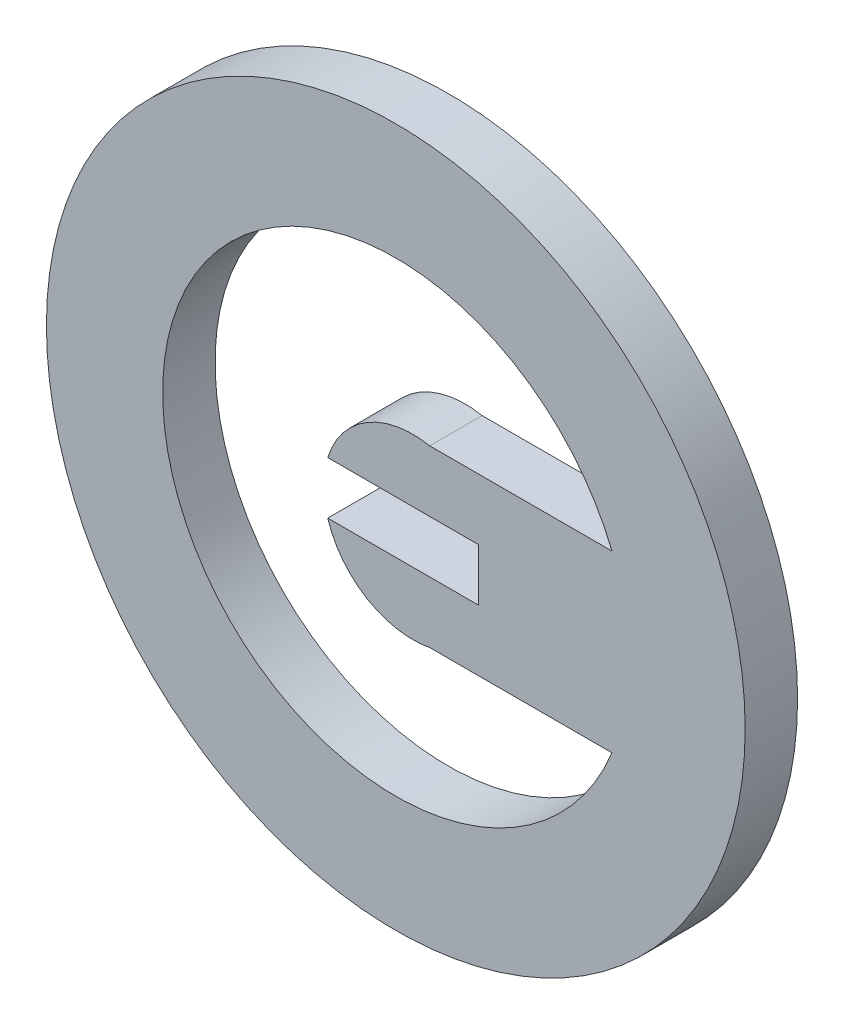
ISO-10303-21;
HEADER;
FILE_DESCRIPTION(('STEP AP214'),'2;1');
FILE_NAME('part.step','',(''),(''),'','','');
FILE_SCHEMA(('AUTOMOTIVE_DESIGN { 1 0 10303 214 1 1 1 1 }'));
ENDSEC;
DATA;
#1=APPLICATION_CONTEXT('core data for automotive mechanical design processes');
#2=APPLICATION_PROTOCOL_DEFINITION('international standard','automotive_design',2000,#1);
#3=PRODUCT_CONTEXT('',#1,'mechanical');
#4=PRODUCT('Part','Part','',(#3));
#5=PRODUCT_RELATED_PRODUCT_CATEGORY('part','',(#4));
#6=PRODUCT_DEFINITION_FORMATION('','',#4);
#7=PRODUCT_DEFINITION_CONTEXT('part definition',#1,'design');
#8=PRODUCT_DEFINITION('design','',#6,#7);
#9=PRODUCT_DEFINITION_SHAPE('','',#8);
#10=(LENGTH_UNIT() NAMED_UNIT(*) SI_UNIT(.MILLI.,.METRE.));
#11=(NAMED_UNIT(*) PLANE_ANGLE_UNIT() SI_UNIT($,.RADIAN.));
#12=(NAMED_UNIT(*) SI_UNIT($,.STERADIAN.) SOLID_ANGLE_UNIT());
#13=UNCERTAINTY_MEASURE_WITH_UNIT(LENGTH_MEASURE(1.E-05),#10,'distance_accuracy_value','');
#14=(GEOMETRIC_REPRESENTATION_CONTEXT(3) GLOBAL_UNCERTAINTY_ASSIGNED_CONTEXT((#13)) GLOBAL_UNIT_ASSIGNED_CONTEXT((#10,
#11,#12)) REPRESENTATION_CONTEXT('',''));
#15=CARTESIAN_POINT('',(0.,0.,0.));
#16=DIRECTION('',(0.,0.,1.));
#17=DIRECTION('',(1.,0.,0.));
#18=AXIS2_PLACEMENT_3D('',#15,#16,#17);
#19=CARTESIAN_POINT('',(0.,0.,2.99999999999998));
#20=DIRECTION('',(0.,0.,1.));
#21=DIRECTION('',(1.,0.,0.));
#22=AXIS2_PLACEMENT_3D('',#19,#20,#21);
#23=PLANE('',#22);
#24=CARTESIAN_POINT('',(0.,0.,2.99999999999998));
#25=DIRECTION('',(0.,0.,1.));
#26=DIRECTION('',(1.,0.,0.));
#27=AXIS2_PLACEMENT_3D('',#24,#25,#26);
#28=CIRCLE('',#27,20.);
#29=CARTESIAN_POINT('',(-19.9999999999999,0.,2.99999999999997));
#30=VERTEX_POINT('',#29);
#31=EDGE_CURVE('E11',#30,#30,#28,.T.);
#32=ORIENTED_EDGE('',*,*,#31,.T.);
#33=EDGE_LOOP('',(#32));
#34=FACE_BOUND('',#33,.T.);
#35=DIRECTION('',(1.,0.,0.));
#36=VECTOR('',#35,1.);
#37=CARTESIAN_POINT('',(-3.89564307879012,-1.5,2.99999999999998));
#38=LINE('',#37,#36);
#39=CARTESIAN_POINT('',(-3.89564307879012,-1.5,2.99999999999998));
#40=VERTEX_POINT('',#39);
#41=CARTESIAN_POINT('',(4.73620170339689,-1.50000000000001,2.99999999999996));
#42=VERTEX_POINT('',#41);
#43=EDGE_CURVE('E134',#40,#42,#38,.T.);
#44=ORIENTED_EDGE('',*,*,#43,.F.);
#45=CARTESIAN_POINT('',(0.972107152720308,0.,2.99999999999998));
#46=DIRECTION('',(0.,0.,-1.));
#47=DIRECTION('',(1.,0.,0.));
#48=AXIS2_PLACEMENT_3D('',#45,#46,#47);
#49=CIRCLE('',#48,5.09362271044586);
#50=CARTESIAN_POINT('',(1.94421430544053,-5.00000000000002,2.99999999999999));
#51=VERTEX_POINT('',#50);
#52=EDGE_CURVE('E112',#51,#40,#49,.T.);
#53=ORIENTED_EDGE('',*,*,#52,.F.);
#54=DIRECTION('',(-1.,0.,0.));
#55=VECTOR('',#54,1.);
#56=CARTESIAN_POINT('',(1.94421430544053,-5.00000000000002,2.99999999999999));
#57=LINE('',#56,#55);
#58=CARTESIAN_POINT('',(12.3734497336033,-5.,2.99999999999998));
#59=VERTEX_POINT('',#58);
#60=EDGE_CURVE('E146',#59,#51,#57,.T.);
#61=ORIENTED_EDGE('',*,*,#60,.F.);
#62=CARTESIAN_POINT('',(0.,0.,2.99999999999998));
#63=DIRECTION('',(0.,0.,1.));
#64=DIRECTION('',(1.,0.,0.));
#65=AXIS2_PLACEMENT_3D('',#62,#63,#64);
#66=CIRCLE('',#65,13.3454958060766);
#67=CARTESIAN_POINT('',(12.3734497336033,4.99999999999999,3.));
#68=VERTEX_POINT('',#67);
#69=EDGE_CURVE('E144',#68,#59,#66,.T.);
#70=ORIENTED_EDGE('',*,*,#69,.F.);
#71=DIRECTION('',(1.,0.,0.));
#72=VECTOR('',#71,1.);
#73=CARTESIAN_POINT('',(1.94421430544053,4.99999999999999,2.99999999999996));
#74=LINE('',#73,#72);
#75=CARTESIAN_POINT('',(1.94421430544053,4.99999999999999,2.99999999999996));
#76=VERTEX_POINT('',#75);
#77=EDGE_CURVE('E142',#76,#68,#74,.T.);
#78=ORIENTED_EDGE('',*,*,#77,.F.);
#79=CARTESIAN_POINT('',(0.972107152720308,0.,2.99999999999998));
#80=DIRECTION('',(0.,0.,-1.));
#81=DIRECTION('',(1.,0.,0.));
#82=AXIS2_PLACEMENT_3D('',#79,#80,#81);
#83=CIRCLE('',#82,5.09362271044586);
#84=CARTESIAN_POINT('',(-3.89564307879021,1.49999999999999,2.99999999999998));
#85=VERTEX_POINT('',#84);
#86=EDGE_CURVE('E140',#85,#76,#83,.T.);
#87=ORIENTED_EDGE('',*,*,#86,.F.);
#88=DIRECTION('',(-1.,0.,0.));
#89=VECTOR('',#88,1.);
#90=CARTESIAN_POINT('',(-3.89564307879021,1.49999999999999,2.99999999999998));
#91=LINE('',#90,#89);
#92=CARTESIAN_POINT('',(4.7362017033968,1.49999999999999,2.99999999999996));
#93=VERTEX_POINT('',#92);
#94=EDGE_CURVE('E138',#93,#85,#91,.T.);
#95=ORIENTED_EDGE('',*,*,#94,.F.);
#96=DIRECTION('',(0.,1.,0.));
#97=VECTOR('',#96,1.);
#98=CARTESIAN_POINT('',(4.7362017033968,1.49999999999999,2.99999999999996));
#99=LINE('',#98,#97);
#100=EDGE_CURVE('E136',#42,#93,#99,.T.);
#101=ORIENTED_EDGE('',*,*,#100,.F.);
#102=EDGE_LOOP('',(#44,#53,#61,#70,#78,#87,#95,#101));
#103=FACE_BOUND('',#102,.T.);
#104=ADVANCED_FACE('F32',(#34,#103),#23,.T.);
#105=CARTESIAN_POINT('',(0.,0.,0.));
#106=DIRECTION('',(0.,0.,1.));
#107=DIRECTION('',(1.,0.,0.));
#108=AXIS2_PLACEMENT_3D('',#105,#106,#107);
#109=PLANE('',#108);
#110=CARTESIAN_POINT('',(0.,0.,0.));
#111=DIRECTION('',(0.,0.,1.));
#112=DIRECTION('',(1.,0.,0.));
#113=AXIS2_PLACEMENT_3D('',#110,#111,#112);
#114=CIRCLE('',#113,20.);
#115=CARTESIAN_POINT('',(-19.9999999999999,0.,0.));
#116=VERTEX_POINT('',#115);
#117=EDGE_CURVE('E40',#116,#116,#114,.T.);
#118=ORIENTED_EDGE('',*,*,#117,.F.);
#119=EDGE_LOOP('',(#118));
#120=FACE_BOUND('',#119,.T.);
#121=CARTESIAN_POINT('',(0.972107152720246,0.,0.));
#122=DIRECTION('',(0.,0.,-1.));
#123=DIRECTION('',(1.,0.,0.));
#124=AXIS2_PLACEMENT_3D('',#121,#122,#123);
#125=CIRCLE('',#124,5.09362271044586);
#126=CARTESIAN_POINT('',(1.9442143054405,-5.,0.));
#127=VERTEX_POINT('',#126);
#128=CARTESIAN_POINT('',(-3.89564307879017,-1.5,0.));
#129=VERTEX_POINT('',#128);
#130=EDGE_CURVE('E55',#127,#129,#125,.T.);
#131=ORIENTED_EDGE('',*,*,#130,.T.);
#132=DIRECTION('',(1.,0.,0.));
#133=VECTOR('',#132,1.);
#134=CARTESIAN_POINT('',(-3.89564307879017,-1.5,0.));
#135=LINE('',#134,#133);
#136=CARTESIAN_POINT('',(4.73620170339689,-1.5,0.));
#137=VERTEX_POINT('',#136);
#138=EDGE_CURVE('E99',#129,#137,#135,.T.);
#139=ORIENTED_EDGE('',*,*,#138,.T.);
#140=DIRECTION('',(0.,1.,0.));
#141=VECTOR('',#140,1.);
#142=CARTESIAN_POINT('',(4.73620170339686,1.5,0.));
#143=LINE('',#142,#141);
#144=CARTESIAN_POINT('',(4.73620170339686,1.5,0.));
#145=VERTEX_POINT('',#144);
#146=EDGE_CURVE('E108',#137,#145,#143,.T.);
#147=ORIENTED_EDGE('',*,*,#146,.T.);
#148=DIRECTION('',(-1.,0.,0.));
#149=VECTOR('',#148,1.);
#150=CARTESIAN_POINT('',(-3.89564307879017,1.49999999999999,0.));
#151=LINE('',#150,#149);
#152=CARTESIAN_POINT('',(-3.89564307879017,1.49999999999999,0.));
#153=VERTEX_POINT('',#152);
#154=EDGE_CURVE('E121',#145,#153,#151,.T.);
#155=ORIENTED_EDGE('',*,*,#154,.T.);
#156=CARTESIAN_POINT('',(0.972107152720246,0.,0.));
#157=DIRECTION('',(0.,0.,-1.));
#158=DIRECTION('',(1.,0.,0.));
#159=AXIS2_PLACEMENT_3D('',#156,#157,#158);
#160=CIRCLE('',#159,5.09362271044586);
#161=CARTESIAN_POINT('',(1.94421430544053,4.99999999999999,0.));
#162=VERTEX_POINT('',#161);
#163=EDGE_CURVE('E124',#153,#162,#160,.T.);
#164=ORIENTED_EDGE('',*,*,#163,.T.);
#165=DIRECTION('',(1.,0.,0.));
#166=VECTOR('',#165,1.);
#167=CARTESIAN_POINT('',(1.94421430544053,4.99999999999999,0.));
#168=LINE('',#167,#166);
#169=CARTESIAN_POINT('',(12.3734497336033,4.99999999999999,0.));
#170=VERTEX_POINT('',#169);
#171=EDGE_CURVE('E127',#162,#170,#168,.T.);
#172=ORIENTED_EDGE('',*,*,#171,.T.);
#173=CARTESIAN_POINT('',(0.,0.,0.));
#174=DIRECTION('',(0.,0.,1.));
#175=DIRECTION('',(1.,0.,0.));
#176=AXIS2_PLACEMENT_3D('',#173,#174,#175);
#177=CIRCLE('',#176,13.3454958060766);
#178=CARTESIAN_POINT('',(12.3734497336033,-5.,0.));
#179=VERTEX_POINT('',#178);
#180=EDGE_CURVE('E130',#170,#179,#177,.T.);
#181=ORIENTED_EDGE('',*,*,#180,.T.);
#182=DIRECTION('',(-1.,0.,0.));
#183=VECTOR('',#182,1.);
#184=CARTESIAN_POINT('',(1.9442143054405,-5.,0.));
#185=LINE('',#184,#183);
#186=EDGE_CURVE('E117',#179,#127,#185,.T.);
#187=ORIENTED_EDGE('',*,*,#186,.T.);
#188=EDGE_LOOP('',(#131,#139,#147,#155,#164,#172,#181,#187));
#189=FACE_BOUND('',#188,.T.);
#190=ADVANCED_FACE('F115',(#120,#189),#109,.F.);
#191=CARTESIAN_POINT('',(0.,0.,2.99999999999998));
#192=DIRECTION('',(0.,0.,-1.));
#193=DIRECTION('',(-1.,0.,0.));
#194=AXIS2_PLACEMENT_3D('',#191,#192,#193);
#195=CYLINDRICAL_SURFACE('',#194,20.);
#196=CARTESIAN_POINT('',(-19.9999999999999,0.,2.99999999999997));
#197=CARTESIAN_POINT('',(-19.9999999999999,0.,2.96874999999997));
#198=CARTESIAN_POINT('',(-19.9999999999999,0.,2.93749999999997));
#199=CARTESIAN_POINT('',(-19.9999999999999,0.,2.87499999999997));
#200=CARTESIAN_POINT('',(-19.9999999999999,0.,2.84374999999997));
#201=CARTESIAN_POINT('',(-19.9999999999999,0.,2.78124999999997));
#202=CARTESIAN_POINT('',(-19.9999999999999,0.,2.74999999999997));
#203=CARTESIAN_POINT('',(-19.9999999999999,0.,2.68749999999997));
#204=CARTESIAN_POINT('',(-19.9999999999999,0.,2.65624999999997));
#205=CARTESIAN_POINT('',(-19.9999999999999,0.,2.59374999999997));
#206=CARTESIAN_POINT('',(-19.9999999999999,0.,2.56249999999997));
#207=CARTESIAN_POINT('',(-19.9999999999999,0.,2.49999999999997));
#208=CARTESIAN_POINT('',(-19.9999999999999,0.,2.46874999999997));
#209=CARTESIAN_POINT('',(-19.9999999999999,0.,2.40624999999997));
#210=CARTESIAN_POINT('',(-19.9999999999999,0.,2.37499999999997));
#211=CARTESIAN_POINT('',(-19.9999999999999,0.,2.31249999999997));
#212=CARTESIAN_POINT('',(-19.9999999999999,0.,2.28124999999997));
#213=CARTESIAN_POINT('',(-19.9999999999999,0.,2.21874999999997));
#214=CARTESIAN_POINT('',(-19.9999999999999,0.,2.18749999999997));
#215=CARTESIAN_POINT('',(-19.9999999999999,0.,2.12499999999997));
#216=CARTESIAN_POINT('',(-19.9999999999999,0.,2.09374999999997));
#217=CARTESIAN_POINT('',(-19.9999999999999,0.,2.03124999999997));
#218=CARTESIAN_POINT('',(-19.9999999999999,0.,1.99999999999997));
#219=CARTESIAN_POINT('',(-19.9999999999999,0.,1.93749999999997));
#220=CARTESIAN_POINT('',(-19.9999999999999,0.,1.90624999999997));
#221=CARTESIAN_POINT('',(-19.9999999999999,0.,1.84374999999997));
#222=CARTESIAN_POINT('',(-19.9999999999999,0.,1.81249999999997));
#223=CARTESIAN_POINT('',(-19.9999999999999,0.,1.74999999999997));
#224=CARTESIAN_POINT('',(-19.9999999999999,0.,1.71874999999997));
#225=CARTESIAN_POINT('',(-19.9999999999999,0.,1.65624999999997));
#226=CARTESIAN_POINT('',(-19.9999999999999,0.,1.62499999999997));
#227=CARTESIAN_POINT('',(-19.9999999999999,0.,1.56249999999997));
#228=CARTESIAN_POINT('',(-19.9999999999999,0.,1.53124999999997));
#229=CARTESIAN_POINT('',(-19.9999999999999,0.,1.46874999999997));
#230=CARTESIAN_POINT('',(-19.9999999999999,0.,1.43749999999997));
#231=CARTESIAN_POINT('',(-19.9999999999999,0.,1.37499999999997));
#232=CARTESIAN_POINT('',(-19.9999999999999,0.,1.34374999999997));
#233=CARTESIAN_POINT('',(-19.9999999999999,0.,1.28124999999997));
#234=CARTESIAN_POINT('',(-19.9999999999999,0.,1.24999999999997));
#235=CARTESIAN_POINT('',(-19.9999999999999,0.,1.18749999999997));
#236=CARTESIAN_POINT('',(-19.9999999999999,0.,1.15624999999997));
#237=CARTESIAN_POINT('',(-19.9999999999999,0.,1.09374999999997));
#238=CARTESIAN_POINT('',(-19.9999999999999,0.,1.06249999999997));
#239=CARTESIAN_POINT('',(-19.9999999999999,0.,0.999999999999975));
#240=CARTESIAN_POINT('',(-19.9999999999999,0.,0.968749999999975));
#241=CARTESIAN_POINT('',(-19.9999999999999,0.,0.906249999999975));
#242=CARTESIAN_POINT('',(-19.9999999999999,0.,0.874999999999975));
#243=CARTESIAN_POINT('',(-19.9999999999999,0.,0.812499999999975));
#244=CARTESIAN_POINT('',(-19.9999999999999,0.,0.781249999999975));
#245=CARTESIAN_POINT('',(-19.9999999999999,0.,0.718749999999975));
#246=CARTESIAN_POINT('',(-19.9999999999999,0.,0.687499999999975));
#247=CARTESIAN_POINT('',(-19.9999999999999,0.,0.624999999999975));
#248=CARTESIAN_POINT('',(-19.9999999999999,0.,0.593749999999975));
#249=CARTESIAN_POINT('',(-19.9999999999999,0.,0.531249999999975));
#250=CARTESIAN_POINT('',(-19.9999999999999,0.,0.499999999999976));
#251=CARTESIAN_POINT('',(-19.9999999999999,0.,0.437499999999976));
#252=CARTESIAN_POINT('',(-19.9999999999999,0.,0.406249999999976));
#253=CARTESIAN_POINT('',(-19.9999999999999,0.,0.343749999999976));
#254=CARTESIAN_POINT('',(-19.9999999999999,0.,0.312499999999976));
#255=CARTESIAN_POINT('',(-19.9999999999999,0.,0.249999999999976));
#256=CARTESIAN_POINT('',(-19.9999999999999,0.,0.218749999999976));
#257=CARTESIAN_POINT('',(-19.9999999999999,0.,0.156249999999976));
#258=CARTESIAN_POINT('',(-19.9999999999999,0.,0.124999999999976));
#259=CARTESIAN_POINT('',(-19.9999999999999,0.,0.0624999999999762));
#260=CARTESIAN_POINT('',(-19.9999999999999,0.,0.0312499999999762));
#261=CARTESIAN_POINT('',(-19.9999999999999,0.,0.));
#262=B_SPLINE_CURVE_WITH_KNOTS('',3,(#196,#197,#198,#199,#200,#201,#202,#203,#204,#205,#206,
#207,#208,#209,#210,#211,#212,#213,#214,#215,#216,#217,#218,#219,#220,#221,#222,#223,#224,#225,
#226,#227,#228,#229,#230,#231,#232,#233,#234,#235,#236,#237,#238,#239,#240,#241,#242,#243,#244,
#245,#246,#247,#248,#249,#250,#251,#252,#253,#254,#255,#256,#257,#258,#259,#260,#261),
.UNSPECIFIED.,.F.,.F.,(4,2,2,2,2,2,2,2,2,2,2,2,2,2,2,2,2,2,2,2,2,2,2,2,2,2,2,2,2,2,2,2,4),(0.,
0.0937500000000001,0.1875,0.28125,0.375,0.46875,0.562499999999999,0.656249999999999,
0.749999999999999,0.843749999999999,0.937499999999999,1.03125,1.125,1.21875,1.3125,1.40625,1.5,
1.59375,1.6875,1.78125,1.875,1.96875,2.0625,2.15625,2.25,2.34375,2.4375,2.53125,2.625,2.71875,
2.8125,2.90625,3.),.UNSPECIFIED.);
#263=EDGE_CURVE('BSEAM34',#30,#116,#262,.T.);
#264=ORIENTED_EDGE('',*,*,#31,.F.);
#265=ORIENTED_EDGE('',*,*,#117,.T.);
#266=ORIENTED_EDGE('',*,*,#263,.T.);
#267=ORIENTED_EDGE('',*,*,#263,.F.);
#268=EDGE_LOOP('',(#264,#266,#265,#267));
#269=FACE_BOUND('',#268,.T.);
#270=ADVANCED_FACE('F34',(#269),#195,.T.);
#271=CARTESIAN_POINT('',(0.972107152720308,0.,2.99999999999998));
#272=DIRECTION('',(0.,0.,-1.));
#273=DIRECTION('',(-1.,0.,0.));
#274=AXIS2_PLACEMENT_3D('',#271,#272,#273);
#275=CYLINDRICAL_SURFACE('',#274,5.09362271044586);
#276=ORIENTED_EDGE('',*,*,#130,.F.);
#277=DIRECTION('',(0.,0.,-1.));
#278=VECTOR('',#277,1.);
#279=CARTESIAN_POINT('',(1.94421430544053,-5.00000000000002,2.99999999999999));
#280=LINE('',#279,#278);
#281=EDGE_CURVE('E148',#51,#127,#280,.T.);
#282=ORIENTED_EDGE('',*,*,#281,.F.);
#283=ORIENTED_EDGE('',*,*,#52,.T.);
#284=DIRECTION('',(0.,0.,-1.));
#285=VECTOR('',#284,1.);
#286=CARTESIAN_POINT('',(-3.89564307879012,-1.5,2.99999999999998));
#287=LINE('',#286,#285);
#288=EDGE_CURVE('E101',#40,#129,#287,.T.);
#289=ORIENTED_EDGE('',*,*,#288,.T.);
#290=EDGE_LOOP('',(#276,#282,#283,#289));
#291=FACE_BOUND('',#290,.T.);
#292=ADVANCED_FACE('F110',(#291),#275,.T.);
#293=CARTESIAN_POINT('',(-3.89564307879012,-1.5,2.99999999999998));
#294=DIRECTION('',(0.,1.,0.));
#295=DIRECTION('',(0.,0.,1.));
#296=AXIS2_PLACEMENT_3D('',#293,#294,#295);
#297=PLANE('',#296);
#298=ORIENTED_EDGE('',*,*,#138,.F.);
#299=ORIENTED_EDGE('',*,*,#288,.F.);
#300=ORIENTED_EDGE('',*,*,#43,.T.);
#301=DIRECTION('',(0.,0.,-1.));
#302=VECTOR('',#301,1.);
#303=CARTESIAN_POINT('',(4.73620170339689,-1.50000000000001,2.99999999999996));
#304=LINE('',#303,#302);
#305=EDGE_CURVE('E104',#42,#137,#304,.T.);
#306=ORIENTED_EDGE('',*,*,#305,.T.);
#307=EDGE_LOOP('',(#298,#299,#300,#306));
#308=FACE_BOUND('',#307,.T.);
#309=ADVANCED_FACE('F100',(#308),#297,.T.);
#310=CARTESIAN_POINT('',(4.7362017033968,1.49999999999999,2.99999999999996));
#311=DIRECTION('',(-1.,0.,0.));
#312=DIRECTION('',(0.,0.,1.));
#313=AXIS2_PLACEMENT_3D('',#310,#311,#312);
#314=PLANE('',#313);
#315=ORIENTED_EDGE('',*,*,#146,.F.);
#316=ORIENTED_EDGE('',*,*,#305,.F.);
#317=ORIENTED_EDGE('',*,*,#100,.T.);
#318=DIRECTION('',(0.,0.,-1.));
#319=VECTOR('',#318,1.);
#320=CARTESIAN_POINT('',(4.7362017033968,1.49999999999999,2.99999999999996));
#321=LINE('',#320,#319);
#322=EDGE_CURVE('E157',#93,#145,#321,.T.);
#323=ORIENTED_EDGE('',*,*,#322,.T.);
#324=EDGE_LOOP('',(#315,#316,#317,#323));
#325=FACE_BOUND('',#324,.T.);
#326=ADVANCED_FACE('F176',(#325),#314,.T.);
#327=CARTESIAN_POINT('',(-3.89564307879021,1.49999999999999,2.99999999999998));
#328=DIRECTION('',(0.,-1.,0.));
#329=DIRECTION('',(0.,0.,-1.));
#330=AXIS2_PLACEMENT_3D('',#327,#328,#329);
#331=PLANE('',#330);
#332=ORIENTED_EDGE('',*,*,#154,.F.);
#333=ORIENTED_EDGE('',*,*,#322,.F.);
#334=ORIENTED_EDGE('',*,*,#94,.T.);
#335=DIRECTION('',(0.,0.,-1.));
#336=VECTOR('',#335,1.);
#337=CARTESIAN_POINT('',(-3.89564307879021,1.49999999999999,2.99999999999998));
#338=LINE('',#337,#336);
#339=EDGE_CURVE('E155',#85,#153,#338,.T.);
#340=ORIENTED_EDGE('',*,*,#339,.T.);
#341=EDGE_LOOP('',(#332,#333,#334,#340));
#342=FACE_BOUND('',#341,.T.);
#343=ADVANCED_FACE('F179',(#342),#331,.T.);
#344=CARTESIAN_POINT('',(0.972107152720308,0.,2.99999999999998));
#345=DIRECTION('',(0.,0.,-1.));
#346=DIRECTION('',(-1.,0.,0.));
#347=AXIS2_PLACEMENT_3D('',#344,#345,#346);
#348=CYLINDRICAL_SURFACE('',#347,5.09362271044586);
#349=ORIENTED_EDGE('',*,*,#163,.F.);
#350=ORIENTED_EDGE('',*,*,#339,.F.);
#351=ORIENTED_EDGE('',*,*,#86,.T.);
#352=DIRECTION('',(0.,0.,-1.));
#353=VECTOR('',#352,1.);
#354=CARTESIAN_POINT('',(1.94421430544053,4.99999999999999,2.99999999999996));
#355=LINE('',#354,#353);
#356=EDGE_CURVE('E153',#76,#162,#355,.T.);
#357=ORIENTED_EDGE('',*,*,#356,.T.);
#358=EDGE_LOOP('',(#349,#350,#351,#357));
#359=FACE_BOUND('',#358,.T.);
#360=ADVANCED_FACE('F183',(#359),#348,.T.);
#361=CARTESIAN_POINT('',(1.94421430544053,4.99999999999999,2.99999999999996));
#362=DIRECTION('',(0.,1.,0.));
#363=DIRECTION('',(0.,0.,1.));
#364=AXIS2_PLACEMENT_3D('',#361,#362,#363);
#365=PLANE('',#364);
#366=ORIENTED_EDGE('',*,*,#171,.F.);
#367=ORIENTED_EDGE('',*,*,#356,.F.);
#368=ORIENTED_EDGE('',*,*,#77,.T.);
#369=DIRECTION('',(0.,0.,-1.));
#370=VECTOR('',#369,1.);
#371=CARTESIAN_POINT('',(12.3734497336033,4.99999999999999,3.));
#372=LINE('',#371,#370);
#373=EDGE_CURVE('E151',#68,#170,#372,.T.);
#374=ORIENTED_EDGE('',*,*,#373,.T.);
#375=EDGE_LOOP('',(#366,#367,#368,#374));
#376=FACE_BOUND('',#375,.T.);
#377=ADVANCED_FACE('F187',(#376),#365,.T.);
#378=CARTESIAN_POINT('',(0.,0.,2.99999999999998));
#379=DIRECTION('',(0.,0.,-1.));
#380=DIRECTION('',(-1.,0.,0.));
#381=AXIS2_PLACEMENT_3D('',#378,#379,#380);
#382=CYLINDRICAL_SURFACE('',#381,13.3454958060766);
#383=ORIENTED_EDGE('',*,*,#180,.F.);
#384=ORIENTED_EDGE('',*,*,#373,.F.);
#385=ORIENTED_EDGE('',*,*,#69,.T.);
#386=DIRECTION('',(0.,0.,-1.));
#387=VECTOR('',#386,1.);
#388=CARTESIAN_POINT('',(12.3734497336033,-5.,2.99999999999998));
#389=LINE('',#388,#387);
#390=EDGE_CURVE('E47',#59,#179,#389,.T.);
#391=ORIENTED_EDGE('',*,*,#390,.T.);
#392=EDGE_LOOP('',(#383,#384,#385,#391));
#393=FACE_BOUND('',#392,.T.);
#394=ADVANCED_FACE('F191',(#393),#382,.F.);
#395=CARTESIAN_POINT('',(1.94421430544053,-5.00000000000002,2.99999999999999));
#396=DIRECTION('',(0.,-1.,0.));
#397=DIRECTION('',(0.,0.,-1.));
#398=AXIS2_PLACEMENT_3D('',#395,#396,#397);
#399=PLANE('',#398);
#400=ORIENTED_EDGE('',*,*,#186,.F.);
#401=ORIENTED_EDGE('',*,*,#390,.F.);
#402=ORIENTED_EDGE('',*,*,#60,.T.);
#403=ORIENTED_EDGE('',*,*,#281,.T.);
#404=EDGE_LOOP('',(#400,#401,#402,#403));
#405=FACE_BOUND('',#404,.T.);
#406=ADVANCED_FACE('F195',(#405),#399,.T.);
#407=CLOSED_SHELL('',(#104,#190,#270,#292,#309,#326,#343,#360,#377,#394,#406));
#408=MANIFOLD_SOLID_BREP('B2',#407);
#409=ADVANCED_BREP_SHAPE_REPRESENTATION('',(#18,#408),#14);
#410=SHAPE_DEFINITION_REPRESENTATION(#9,#409);
ENDSEC;
END-ISO-10303-21;
